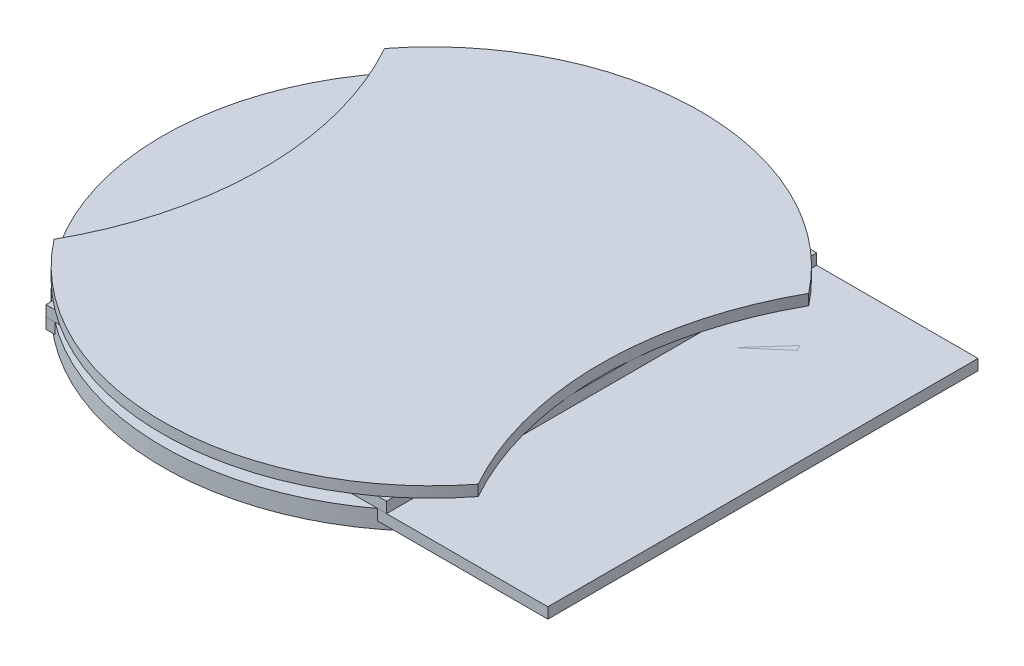
ISO-10303-21;
HEADER;
FILE_DESCRIPTION(('STEP AP214'),'2;1');
FILE_NAME('part.step','',(''),(''),'','','');
FILE_SCHEMA(('AUTOMOTIVE_DESIGN { 1 0 10303 214 1 1 1 1 }'));
ENDSEC;
DATA;
#1=APPLICATION_CONTEXT('core data for automotive mechanical design processes');
#2=APPLICATION_PROTOCOL_DEFINITION('international standard','automotive_design',2000,#1);
#3=PRODUCT_CONTEXT('',#1,'mechanical');
#4=PRODUCT('Part','Part','',(#3));
#5=PRODUCT_RELATED_PRODUCT_CATEGORY('part','',(#4));
#6=PRODUCT_DEFINITION_FORMATION('','',#4);
#7=PRODUCT_DEFINITION_CONTEXT('part definition',#1,'design');
#8=PRODUCT_DEFINITION('design','',#6,#7);
#9=PRODUCT_DEFINITION_SHAPE('','',#8);
#10=(LENGTH_UNIT() NAMED_UNIT(*) SI_UNIT(.MILLI.,.METRE.));
#11=(NAMED_UNIT(*) PLANE_ANGLE_UNIT() SI_UNIT($,.RADIAN.));
#12=(NAMED_UNIT(*) SI_UNIT($,.STERADIAN.) SOLID_ANGLE_UNIT());
#13=UNCERTAINTY_MEASURE_WITH_UNIT(LENGTH_MEASURE(1.E-05),#10,'distance_accuracy_value','');
#14=(GEOMETRIC_REPRESENTATION_CONTEXT(3) GLOBAL_UNCERTAINTY_ASSIGNED_CONTEXT((#13)) GLOBAL_UNIT_ASSIGNED_CONTEXT((#10,
#11,#12)) REPRESENTATION_CONTEXT('',''));
#15=CARTESIAN_POINT('',(0.,0.,0.));
#16=DIRECTION('',(0.,0.,1.));
#17=DIRECTION('',(1.,0.,0.));
#18=AXIS2_PLACEMENT_3D('',#15,#16,#17);
#19=CARTESIAN_POINT('',(7.49999999999986,13.,-5.15));
#20=DIRECTION('',(0.,-1.,0.));
#21=DIRECTION('',(0.,0.,-1.));
#22=AXIS2_PLACEMENT_3D('',#19,#20,#21);
#23=CYLINDRICAL_SURFACE('',#22,1.25);
#24=CARTESIAN_POINT('',(7.49999999999986,3.,-5.15));
#25=DIRECTION('',(0.,-1.,0.));
#26=DIRECTION('',(0.,0.,-1.));
#27=AXIS2_PLACEMENT_3D('',#24,#25,#26);
#28=CIRCLE('',#27,1.25);
#29=CARTESIAN_POINT('',(7.49999999999986,3.,-6.4));
#30=VERTEX_POINT('',#29);
#31=EDGE_CURVE('E87',#30,#30,#28,.F.);
#32=ORIENTED_EDGE('',*,*,#31,.T.);
#33=EDGE_LOOP('',(#32));
#34=FACE_BOUND('',#33,.T.);
#35=CARTESIAN_POINT('',(7.49999999999986,-2.,-5.15));
#36=DIRECTION('',(0.,-1.,0.));
#37=DIRECTION('',(0.,0.,-1.));
#38=AXIS2_PLACEMENT_3D('',#35,#36,#37);
#39=CIRCLE('',#38,1.25);
#40=CARTESIAN_POINT('',(7.49999999999986,-2.,-6.4));
#41=VERTEX_POINT('',#40);
#42=EDGE_CURVE('E96',#41,#41,#39,.T.);
#43=ORIENTED_EDGE('',*,*,#42,.T.);
#44=EDGE_LOOP('',(#43));
#45=FACE_BOUND('',#44,.T.);
#46=ADVANCED_FACE('F49',(#34,#45),#23,.F.);
#47=CARTESIAN_POINT('',(87.4999999999999,13.,-5.14999999999999));
#48=DIRECTION('',(0.,-1.,0.));
#49=DIRECTION('',(0.,0.,-1.));
#50=AXIS2_PLACEMENT_3D('',#47,#48,#49);
#51=CYLINDRICAL_SURFACE('',#50,1.25000000000001);
#52=CARTESIAN_POINT('',(87.4999999999999,3.,-5.14999999999999));
#53=DIRECTION('',(0.,-1.,0.));
#54=DIRECTION('',(0.,0.,-1.));
#55=AXIS2_PLACEMENT_3D('',#52,#53,#54);
#56=CIRCLE('',#55,1.25000000000001);
#57=CARTESIAN_POINT('',(87.4999999999999,3.,-6.4));
#58=VERTEX_POINT('',#57);
#59=EDGE_CURVE('E79',#58,#58,#56,.F.);
#60=ORIENTED_EDGE('',*,*,#59,.T.);
#61=EDGE_LOOP('',(#60));
#62=FACE_BOUND('',#61,.T.);
#63=CARTESIAN_POINT('',(87.4999999999999,-2.,-5.14999999999999));
#64=DIRECTION('',(0.,-1.,0.));
#65=DIRECTION('',(0.,0.,-1.));
#66=AXIS2_PLACEMENT_3D('',#63,#64,#65);
#67=CIRCLE('',#66,1.25000000000001);
#68=CARTESIAN_POINT('',(87.4999999999999,-2.,-6.4));
#69=VERTEX_POINT('',#68);
#70=EDGE_CURVE('E61',#69,#69,#67,.T.);
#71=ORIENTED_EDGE('',*,*,#70,.T.);
#72=EDGE_LOOP('',(#71));
#73=FACE_BOUND('',#72,.T.);
#74=ADVANCED_FACE('F101',(#62,#73),#51,.F.);
#75=CARTESIAN_POINT('',(87.4999999999999,13.,-114.85));
#76=DIRECTION('',(0.,-1.,0.));
#77=DIRECTION('',(0.,0.,-1.));
#78=AXIS2_PLACEMENT_3D('',#75,#76,#77);
#79=CYLINDRICAL_SURFACE('',#78,1.25000000000001);
#80=CARTESIAN_POINT('',(87.4999999999999,3.,-114.85));
#81=DIRECTION('',(0.,-1.,0.));
#82=DIRECTION('',(0.,0.,-1.));
#83=AXIS2_PLACEMENT_3D('',#80,#81,#82);
#84=CIRCLE('',#83,1.25000000000001);
#85=CARTESIAN_POINT('',(87.4999999999999,3.,-116.1));
#86=VERTEX_POINT('',#85);
#87=EDGE_CURVE('E74',#86,#86,#84,.F.);
#88=ORIENTED_EDGE('',*,*,#87,.T.);
#89=EDGE_LOOP('',(#88));
#90=FACE_BOUND('',#89,.T.);
#91=CARTESIAN_POINT('',(87.4999999999999,-2.,-114.85));
#92=DIRECTION('',(0.,-1.,0.));
#93=DIRECTION('',(0.,0.,-1.));
#94=AXIS2_PLACEMENT_3D('',#91,#92,#93);
#95=CIRCLE('',#94,1.25000000000001);
#96=CARTESIAN_POINT('',(87.4999999999999,-2.,-116.1));
#97=VERTEX_POINT('',#96);
#98=EDGE_CURVE('E90',#97,#97,#95,.T.);
#99=ORIENTED_EDGE('',*,*,#98,.T.);
#100=EDGE_LOOP('',(#99));
#101=FACE_BOUND('',#100,.T.);
#102=ADVANCED_FACE('F116',(#90,#101),#79,.F.);
#103=CARTESIAN_POINT('',(7.49999999999986,13.,-114.85));
#104=DIRECTION('',(0.,-1.,0.));
#105=DIRECTION('',(0.,0.,-1.));
#106=AXIS2_PLACEMENT_3D('',#103,#104,#105);
#107=CYLINDRICAL_SURFACE('',#106,1.25);
#108=CARTESIAN_POINT('',(7.49999999999986,3.,-114.85));
#109=DIRECTION('',(0.,-1.,0.));
#110=DIRECTION('',(0.,0.,-1.));
#111=AXIS2_PLACEMENT_3D('',#108,#109,#110);
#112=CIRCLE('',#111,1.25);
#113=CARTESIAN_POINT('',(7.49999999999986,3.,-116.1));
#114=VERTEX_POINT('',#113);
#115=EDGE_CURVE('E70',#114,#114,#112,.F.);
#116=ORIENTED_EDGE('',*,*,#115,.T.);
#117=EDGE_LOOP('',(#116));
#118=FACE_BOUND('',#117,.T.);
#119=CARTESIAN_POINT('',(7.49999999999986,-2.,-114.85));
#120=DIRECTION('',(0.,-1.,0.));
#121=DIRECTION('',(0.,0.,-1.));
#122=AXIS2_PLACEMENT_3D('',#119,#120,#121);
#123=CIRCLE('',#122,1.25);
#124=CARTESIAN_POINT('',(7.49999999999986,-2.,-116.1));
#125=VERTEX_POINT('',#124);
#126=EDGE_CURVE('E93',#125,#125,#123,.T.);
#127=ORIENTED_EDGE('',*,*,#126,.T.);
#128=EDGE_LOOP('',(#127));
#129=FACE_BOUND('',#128,.T.);
#130=ADVANCED_FACE('F118',(#118,#129),#107,.F.);
#131=CARTESIAN_POINT('',(47.5,3.,-60.));
#132=DIRECTION('',(0.,-1.,0.));
#133=DIRECTION('',(0.,0.,-1.));
#134=AXIS2_PLACEMENT_3D('',#131,#132,#133);
#135=PLANE('',#134);
#136=CARTESIAN_POINT('',(111.7,3.,-60.));
#137=DIRECTION('',(0.,1.,0.));
#138=DIRECTION('',(0.,0.,1.));
#139=AXIS2_PLACEMENT_3D('',#136,#137,#138);
#140=CIRCLE('',#139,8.50000000000001);
#141=CARTESIAN_POINT('',(111.7,3.,-51.5));
#142=VERTEX_POINT('',#141);
#143=EDGE_CURVE('E166',#142,#142,#140,.T.);
#144=ORIENTED_EDGE('',*,*,#143,.F.);
#145=EDGE_LOOP('',(#144));
#146=FACE_BOUND('',#145,.T.);
#147=CARTESIAN_POINT('',(79.7,3.,-60.));
#148=DIRECTION('',(0.,1.,0.));
#149=DIRECTION('',(0.,0.,1.));
#150=AXIS2_PLACEMENT_3D('',#147,#148,#149);
#151=CIRCLE('',#150,8.50000000000001);
#152=CARTESIAN_POINT('',(79.7,3.,-51.5));
#153=VERTEX_POINT('',#152);
#154=EDGE_CURVE('E68',#153,#153,#151,.T.);
#155=ORIENTED_EDGE('',*,*,#154,.F.);
#156=EDGE_LOOP('',(#155));
#157=FACE_BOUND('',#156,.T.);
#158=CARTESIAN_POINT('',(47.5,3.,-60.));
#159=DIRECTION('',(0.,1.,0.));
#160=DIRECTION('',(0.,0.,1.));
#161=AXIS2_PLACEMENT_3D('',#158,#159,#160);
#162=CIRCLE('',#161,8.5);
#163=CARTESIAN_POINT('',(47.5,3.,-51.5));
#164=VERTEX_POINT('',#163);
#165=EDGE_CURVE('E82',#164,#164,#162,.T.);
#166=ORIENTED_EDGE('',*,*,#165,.F.);
#167=EDGE_LOOP('',(#166));
#168=FACE_BOUND('',#167,.T.);
#169=CARTESIAN_POINT('',(47.5,3.,-60.));
#170=DIRECTION('',(0.,-1.,0.));
#171=DIRECTION('',(0.,0.,-1.));
#172=AXIS2_PLACEMENT_3D('',#169,#170,#171);
#173=CIRCLE('',#172,75.);
#174=CARTESIAN_POINT('',(47.5,3.,-135.));
#175=VERTEX_POINT('',#174);
#176=EDGE_CURVE('E11',#175,#175,#173,.T.);
#177=ORIENTED_EDGE('',*,*,#176,.F.);
#178=EDGE_LOOP('',(#177));
#179=FACE_BOUND('',#178,.T.);
#180=ORIENTED_EDGE('',*,*,#59,.F.);
#181=EDGE_LOOP('',(#180));
#182=FACE_BOUND('',#181,.T.);
#183=ORIENTED_EDGE('',*,*,#115,.F.);
#184=EDGE_LOOP('',(#183));
#185=FACE_BOUND('',#184,.T.);
#186=ORIENTED_EDGE('',*,*,#87,.F.);
#187=EDGE_LOOP('',(#186));
#188=FACE_BOUND('',#187,.T.);
#189=ORIENTED_EDGE('',*,*,#31,.F.);
#190=EDGE_LOOP('',(#189));
#191=FACE_BOUND('',#190,.T.);
#192=ADVANCED_FACE('F107',(#146,#157,#168,#179,#182,#185,#188,#191),#135,.F.);
#193=CARTESIAN_POINT('',(47.5,-2.,-60.));
#194=DIRECTION('',(0.,-1.,0.));
#195=DIRECTION('',(0.,0.,-1.));
#196=AXIS2_PLACEMENT_3D('',#193,#194,#195);
#197=PLANE('',#196);
#198=CARTESIAN_POINT('',(111.7,-2.,-60.));
#199=DIRECTION('',(0.,-1.,0.));
#200=DIRECTION('',(0.,0.,-1.));
#201=AXIS2_PLACEMENT_3D('',#198,#199,#200);
#202=CIRCLE('',#201,8.50000000000001);
#203=CARTESIAN_POINT('',(111.7,-2.,-68.5));
#204=VERTEX_POINT('',#203);
#205=EDGE_CURVE('E52',#204,#204,#202,.T.);
#206=ORIENTED_EDGE('',*,*,#205,.F.);
#207=EDGE_LOOP('',(#206));
#208=FACE_BOUND('',#207,.T.);
#209=CARTESIAN_POINT('',(79.7,-2.,-60.));
#210=DIRECTION('',(0.,-1.,0.));
#211=DIRECTION('',(0.,0.,-1.));
#212=AXIS2_PLACEMENT_3D('',#209,#210,#211);
#213=CIRCLE('',#212,8.50000000000001);
#214=CARTESIAN_POINT('',(79.7,-2.,-68.5));
#215=VERTEX_POINT('',#214);
#216=EDGE_CURVE('E67',#215,#215,#213,.T.);
#217=ORIENTED_EDGE('',*,*,#216,.F.);
#218=EDGE_LOOP('',(#217));
#219=FACE_BOUND('',#218,.T.);
#220=CARTESIAN_POINT('',(47.5,-2.,-60.));
#221=DIRECTION('',(0.,-1.,0.));
#222=DIRECTION('',(0.,0.,-1.));
#223=AXIS2_PLACEMENT_3D('',#220,#221,#222);
#224=CIRCLE('',#223,8.5);
#225=CARTESIAN_POINT('',(47.5,-2.,-68.5));
#226=VERTEX_POINT('',#225);
#227=EDGE_CURVE('E65',#226,#226,#224,.T.);
#228=ORIENTED_EDGE('',*,*,#227,.F.);
#229=EDGE_LOOP('',(#228));
#230=FACE_BOUND('',#229,.T.);
#231=ORIENTED_EDGE('',*,*,#126,.F.);
#232=EDGE_LOOP('',(#231));
#233=FACE_BOUND('',#232,.T.);
#234=ORIENTED_EDGE('',*,*,#70,.F.);
#235=EDGE_LOOP('',(#234));
#236=FACE_BOUND('',#235,.T.);
#237=CARTESIAN_POINT('',(47.5,-2.,-60.));
#238=DIRECTION('',(0.,-1.,0.));
#239=DIRECTION('',(0.,0.,-1.));
#240=AXIS2_PLACEMENT_3D('',#237,#238,#239);
#241=CIRCLE('',#240,75.);
#242=CARTESIAN_POINT('',(47.5,-2.,-135.));
#243=VERTEX_POINT('',#242);
#244=EDGE_CURVE('E56',#243,#243,#241,.T.);
#245=ORIENTED_EDGE('',*,*,#244,.T.);
#246=EDGE_LOOP('',(#245));
#247=FACE_BOUND('',#246,.T.);
#248=ORIENTED_EDGE('',*,*,#42,.F.);
#249=EDGE_LOOP('',(#248));
#250=FACE_BOUND('',#249,.T.);
#251=ORIENTED_EDGE('',*,*,#98,.F.);
#252=EDGE_LOOP('',(#251));
#253=FACE_BOUND('',#252,.T.);
#254=ADVANCED_FACE('F103',(#208,#219,#230,#233,#236,#247,#250,#253),#197,.T.);
#255=CARTESIAN_POINT('',(47.5,-2.,-60.));
#256=DIRECTION('',(0.,1.,0.));
#257=DIRECTION('',(0.,0.,1.));
#258=AXIS2_PLACEMENT_3D('',#255,#256,#257);
#259=CYLINDRICAL_SURFACE('',#258,75.);
#260=ORIENTED_EDGE('',*,*,#244,.F.);
#261=EDGE_LOOP('',(#260));
#262=FACE_BOUND('',#261,.T.);
#263=ORIENTED_EDGE('',*,*,#176,.T.);
#264=EDGE_LOOP('',(#263));
#265=FACE_BOUND('',#264,.T.);
#266=ADVANCED_FACE('F106',(#262,#265),#259,.T.);
#267=CARTESIAN_POINT('',(47.5,-7.,-60.));
#268=DIRECTION('',(0.,1.,0.));
#269=DIRECTION('',(0.,0.,1.));
#270=AXIS2_PLACEMENT_3D('',#267,#268,#269);
#271=CYLINDRICAL_SURFACE('',#270,8.5);
#272=ORIENTED_EDGE('',*,*,#227,.T.);
#273=EDGE_LOOP('',(#272));
#274=FACE_BOUND('',#273,.T.);
#275=ORIENTED_EDGE('',*,*,#165,.T.);
#276=EDGE_LOOP('',(#275));
#277=FACE_BOUND('',#276,.T.);
#278=ADVANCED_FACE('F144',(#274,#277),#271,.F.);
#279=CARTESIAN_POINT('',(79.7,-7.,-60.));
#280=DIRECTION('',(0.,1.,0.));
#281=DIRECTION('',(0.,0.,1.));
#282=AXIS2_PLACEMENT_3D('',#279,#280,#281);
#283=CYLINDRICAL_SURFACE('',#282,8.50000000000001);
#284=ORIENTED_EDGE('',*,*,#216,.T.);
#285=EDGE_LOOP('',(#284));
#286=FACE_BOUND('',#285,.T.);
#287=ORIENTED_EDGE('',*,*,#154,.T.);
#288=EDGE_LOOP('',(#287));
#289=FACE_BOUND('',#288,.T.);
#290=ADVANCED_FACE('F149',(#286,#289),#283,.F.);
#291=CARTESIAN_POINT('',(111.7,-7.,-60.));
#292=DIRECTION('',(0.,1.,0.));
#293=DIRECTION('',(0.,0.,1.));
#294=AXIS2_PLACEMENT_3D('',#291,#292,#293);
#295=CYLINDRICAL_SURFACE('',#294,8.50000000000001);
#296=ORIENTED_EDGE('',*,*,#205,.T.);
#297=EDGE_LOOP('',(#296));
#298=FACE_BOUND('',#297,.T.);
#299=ORIENTED_EDGE('',*,*,#143,.T.);
#300=EDGE_LOOP('',(#299));
#301=FACE_BOUND('',#300,.T.);
#302=ADVANCED_FACE('F154',(#298,#301),#295,.F.);
#303=CLOSED_SHELL('',(#46,#74,#102,#130,#192,#254,#266,#278,#290,#302));
#304=MANIFOLD_SOLID_BREP('B2',#303);
#305=CARTESIAN_POINT('',(47.5,9.,-60.));
#306=DIRECTION('',(0.,-1.,0.));
#307=DIRECTION('',(0.,0.,-1.));
#308=AXIS2_PLACEMENT_3D('',#305,#306,#307);
#309=CYLINDRICAL_SURFACE('',#308,75.);
#310=CARTESIAN_POINT('',(47.5,6.,-60.));
#311=DIRECTION('',(0.,1.,0.));
#312=DIRECTION('',(0.,0.,1.));
#313=AXIS2_PLACEMENT_3D('',#310,#311,#312);
#314=CIRCLE('',#313,75.);
#315=CARTESIAN_POINT('',(106.66,6.,-106.098746186854));
#316=VERTEX_POINT('',#315);
#317=CARTESIAN_POINT('',(-11.66,6.,-106.098746186854));
#318=VERTEX_POINT('',#317);
#319=EDGE_CURVE('E320',#316,#318,#314,.T.);
#320=ORIENTED_EDGE('',*,*,#319,.T.);
#321=DIRECTION('',(0.,1.,0.));
#322=VECTOR('',#321,1.);
#323=CARTESIAN_POINT('',(-11.66,0.,-106.098746186854));
#324=LINE('',#323,#322);
#325=CARTESIAN_POINT('',(-11.66,9.,-106.098746186854));
#326=VERTEX_POINT('',#325);
#327=EDGE_CURVE('E279',#318,#326,#324,.T.);
#328=ORIENTED_EDGE('',*,*,#327,.T.);
#329=CARTESIAN_POINT('',(47.5,9.,-60.));
#330=DIRECTION('',(0.,1.,0.));
#331=DIRECTION('',(0.,0.,1.));
#332=AXIS2_PLACEMENT_3D('',#329,#330,#331);
#333=CIRCLE('',#332,75.);
#334=CARTESIAN_POINT('',(106.66,9.,-106.098746186854));
#335=VERTEX_POINT('',#334);
#336=EDGE_CURVE('E318',#335,#326,#333,.T.);
#337=ORIENTED_EDGE('',*,*,#336,.F.);
#338=DIRECTION('',(0.,1.,0.));
#339=VECTOR('',#338,1.);
#340=CARTESIAN_POINT('',(106.66,0.,-106.098746186854));
#341=LINE('',#340,#339);
#342=EDGE_CURVE('E326',#316,#335,#341,.T.);
#343=ORIENTED_EDGE('',*,*,#342,.F.);
#344=EDGE_LOOP('',(#320,#328,#337,#343));
#345=FACE_BOUND('',#344,.T.);
#346=ADVANCED_FACE('F264',(#345),#309,.T.);
#347=CARTESIAN_POINT('',(-11.66,9.,-13.9012538131458));
#348=VERTEX_POINT('',#347);
#349=CARTESIAN_POINT('',(106.66,9.,-13.9012538131458));
#350=VERTEX_POINT('',#349);
#351=EDGE_CURVE('E316',#348,#350,#333,.T.);
#352=ORIENTED_EDGE('',*,*,#351,.F.);
#353=DIRECTION('',(0.,1.,0.));
#354=VECTOR('',#353,1.);
#355=CARTESIAN_POINT('',(-11.66,0.,-13.9012538131458));
#356=LINE('',#355,#354);
#357=CARTESIAN_POINT('',(-11.66,6.,-13.9012538131458));
#358=VERTEX_POINT('',#357);
#359=EDGE_CURVE('E302',#358,#348,#356,.T.);
#360=ORIENTED_EDGE('',*,*,#359,.F.);
#361=CARTESIAN_POINT('',(106.66,6.,-13.9012538131458));
#362=VERTEX_POINT('',#361);
#363=EDGE_CURVE('E323',#358,#362,#314,.T.);
#364=ORIENTED_EDGE('',*,*,#363,.T.);
#365=DIRECTION('',(0.,1.,0.));
#366=VECTOR('',#365,1.);
#367=CARTESIAN_POINT('',(106.66,0.,-13.9012538131458));
#368=LINE('',#367,#366);
#369=EDGE_CURVE('E286',#362,#350,#368,.T.);
#370=ORIENTED_EDGE('',*,*,#369,.T.);
#371=EDGE_LOOP('',(#352,#360,#364,#370));
#372=FACE_BOUND('',#371,.T.);
#373=ADVANCED_FACE('F266',(#372),#309,.T.);
#374=CARTESIAN_POINT('',(47.5,9.,-60.));
#375=DIRECTION('',(0.,1.,0.));
#376=DIRECTION('',(0.,0.,1.));
#377=AXIS2_PLACEMENT_3D('',#374,#375,#376);
#378=PLANE('',#377);
#379=CARTESIAN_POINT('',(-94.126810840622,9.,-60.));
#380=DIRECTION('',(0.,1.,0.));
#381=DIRECTION('',(0.,0.,-1.));
#382=AXIS2_PLACEMENT_3D('',#379,#380,#381);
#383=CIRCLE('',#382,94.4768187981736);
#384=EDGE_CURVE('E305',#348,#326,#383,.T.);
#385=ORIENTED_EDGE('',*,*,#384,.F.);
#386=ORIENTED_EDGE('',*,*,#351,.T.);
#387=CARTESIAN_POINT('',(189.126810840622,9.,-60.));
#388=DIRECTION('',(0.,1.,0.));
#389=DIRECTION('',(0.,0.,1.));
#390=AXIS2_PLACEMENT_3D('',#387,#388,#389);
#391=CIRCLE('',#390,94.4768187981736);
#392=EDGE_CURVE('E334',#335,#350,#391,.T.);
#393=ORIENTED_EDGE('',*,*,#392,.F.);
#394=ORIENTED_EDGE('',*,*,#336,.T.);
#395=EDGE_LOOP('',(#385,#386,#393,#394));
#396=FACE_BOUND('',#395,.T.);
#397=ADVANCED_FACE('F314',(#396),#378,.T.);
#398=CARTESIAN_POINT('',(47.5,6.,-60.));
#399=DIRECTION('',(0.,1.,0.));
#400=DIRECTION('',(0.,0.,1.));
#401=AXIS2_PLACEMENT_3D('',#398,#399,#400);
#402=PLANE('',#401);
#403=ORIENTED_EDGE('',*,*,#363,.F.);
#404=CARTESIAN_POINT('',(-94.126810840622,6.,-60.));
#405=DIRECTION('',(0.,1.,0.));
#406=DIRECTION('',(0.,0.,1.));
#407=AXIS2_PLACEMENT_3D('',#404,#405,#406);
#408=CIRCLE('',#407,94.4768187981736);
#409=EDGE_CURVE('E47',#358,#318,#408,.T.);
#410=ORIENTED_EDGE('',*,*,#409,.T.);
#411=ORIENTED_EDGE('',*,*,#319,.F.);
#412=CARTESIAN_POINT('',(189.126810840622,6.,-60.));
#413=DIRECTION('',(0.,1.,0.));
#414=DIRECTION('',(0.,0.,1.));
#415=AXIS2_PLACEMENT_3D('',#412,#413,#414);
#416=CIRCLE('',#415,94.4768187981736);
#417=EDGE_CURVE('E272',#316,#362,#416,.T.);
#418=ORIENTED_EDGE('',*,*,#417,.T.);
#419=EDGE_LOOP('',(#403,#410,#411,#418));
#420=FACE_BOUND('',#419,.T.);
#421=ADVANCED_FACE('F330',(#420),#402,.F.);
#422=CARTESIAN_POINT('',(189.126810840622,0.,-60.));
#423=DIRECTION('',(0.,1.,0.));
#424=DIRECTION('',(0.,0.,1.));
#425=AXIS2_PLACEMENT_3D('',#422,#423,#424);
#426=CYLINDRICAL_SURFACE('',#425,94.4768187981736);
#427=ORIENTED_EDGE('',*,*,#342,.T.);
#428=ORIENTED_EDGE('',*,*,#392,.T.);
#429=ORIENTED_EDGE('',*,*,#369,.F.);
#430=ORIENTED_EDGE('',*,*,#417,.F.);
#431=EDGE_LOOP('',(#427,#428,#429,#430));
#432=FACE_BOUND('',#431,.T.);
#433=ADVANCED_FACE('F332',(#432),#426,.F.);
#434=CARTESIAN_POINT('',(-94.126810840622,0.,-60.));
#435=DIRECTION('',(0.,1.,0.));
#436=DIRECTION('',(0.,0.,1.));
#437=AXIS2_PLACEMENT_3D('',#434,#435,#436);
#438=CYLINDRICAL_SURFACE('',#437,94.4768187981736);
#439=ORIENTED_EDGE('',*,*,#359,.T.);
#440=ORIENTED_EDGE('',*,*,#384,.T.);
#441=ORIENTED_EDGE('',*,*,#327,.F.);
#442=ORIENTED_EDGE('',*,*,#409,.F.);
#443=EDGE_LOOP('',(#439,#440,#441,#442));
#444=FACE_BOUND('',#443,.T.);
#445=ADVANCED_FACE('F304',(#444),#438,.F.);
#446=CLOSED_SHELL('',(#346,#373,#397,#421,#433,#445));
#447=MANIFOLD_SOLID_BREP('B6_NOT_SHOWN',#446);
#448=CARTESIAN_POINT('',(0.,6.,-120.));
#449=DIRECTION('',(1.,0.,0.));
#450=DIRECTION('',(0.,0.,-1.));
#451=AXIS2_PLACEMENT_3D('',#448,#449,#450);
#452=PLANE('',#451);
#453=DIRECTION('',(0.,0.,1.));
#454=VECTOR('',#453,1.);
#455=CARTESIAN_POINT('',(0.,3.,-120.));
#456=LINE('',#455,#454);
#457=CARTESIAN_POINT('',(0.,3.,-120.));
#458=VERTEX_POINT('',#457);
#459=CARTESIAN_POINT('',(0.,3.,0.));
#460=VERTEX_POINT('',#459);
#461=EDGE_CURVE('E456',#458,#460,#456,.T.);
#462=ORIENTED_EDGE('',*,*,#461,.T.);
#463=DIRECTION('',(0.,-1.,0.));
#464=VECTOR('',#463,1.);
#465=CARTESIAN_POINT('',(0.,6.,0.));
#466=LINE('',#465,#464);
#467=CARTESIAN_POINT('',(0.,6.,0.));
#468=VERTEX_POINT('',#467);
#469=EDGE_CURVE('E262',#468,#460,#466,.T.);
#470=ORIENTED_EDGE('',*,*,#469,.F.);
#471=DIRECTION('',(0.,0.,1.));
#472=VECTOR('',#471,1.);
#473=CARTESIAN_POINT('',(0.,6.,-120.));
#474=LINE('',#473,#472);
#475=CARTESIAN_POINT('',(0.,6.,-120.));
#476=VERTEX_POINT('',#475);
#477=EDGE_CURVE('E444',#476,#468,#474,.T.);
#478=ORIENTED_EDGE('',*,*,#477,.F.);
#479=DIRECTION('',(0.,-1.,0.));
#480=VECTOR('',#479,1.);
#481=CARTESIAN_POINT('',(0.,6.,-120.));
#482=LINE('',#481,#480);
#483=EDGE_CURVE('E452',#476,#458,#482,.T.);
#484=ORIENTED_EDGE('',*,*,#483,.T.);
#485=EDGE_LOOP('',(#462,#470,#478,#484));
#486=FACE_BOUND('',#485,.T.);
#487=ADVANCED_FACE('F393',(#486),#452,.F.);
#488=CARTESIAN_POINT('',(0.,6.,0.));
#489=DIRECTION('',(0.,0.,-1.));
#490=DIRECTION('',(-1.,0.,0.));
#491=AXIS2_PLACEMENT_3D('',#488,#489,#490);
#492=PLANE('',#491);
#493=DIRECTION('',(1.,0.,0.));
#494=VECTOR('',#493,1.);
#495=CARTESIAN_POINT('',(0.,3.,0.));
#496=LINE('',#495,#494);
#497=CARTESIAN_POINT('',(95.,3.,0.));
#498=VERTEX_POINT('',#497);
#499=EDGE_CURVE('E448',#460,#498,#496,.T.);
#500=ORIENTED_EDGE('',*,*,#499,.T.);
#501=DIRECTION('',(0.,-1.,0.));
#502=VECTOR('',#501,1.);
#503=CARTESIAN_POINT('',(95.,6.,0.));
#504=LINE('',#503,#502);
#505=CARTESIAN_POINT('',(95.,6.,0.));
#506=VERTEX_POINT('',#505);
#507=EDGE_CURVE('E401',#506,#498,#504,.T.);
#508=ORIENTED_EDGE('',*,*,#507,.F.);
#509=DIRECTION('',(1.,0.,0.));
#510=VECTOR('',#509,1.);
#511=CARTESIAN_POINT('',(0.,6.,0.));
#512=LINE('',#511,#510);
#513=EDGE_CURVE('E439',#468,#506,#512,.T.);
#514=ORIENTED_EDGE('',*,*,#513,.F.);
#515=ORIENTED_EDGE('',*,*,#469,.T.);
#516=EDGE_LOOP('',(#500,#508,#514,#515));
#517=FACE_BOUND('',#516,.T.);
#518=ADVANCED_FACE('F447',(#517),#492,.F.);
#519=CARTESIAN_POINT('',(95.,6.,-120.));
#520=DIRECTION('',(-1.,0.,0.));
#521=DIRECTION('',(0.,0.,1.));
#522=AXIS2_PLACEMENT_3D('',#519,#520,#521);
#523=PLANE('',#522);
#524=DIRECTION('',(0.,0.,-1.));
#525=VECTOR('',#524,1.);
#526=CARTESIAN_POINT('',(95.,3.,-120.));
#527=LINE('',#526,#525);
#528=CARTESIAN_POINT('',(95.,3.,-120.));
#529=VERTEX_POINT('',#528);
#530=EDGE_CURVE('E426',#498,#529,#527,.T.);
#531=ORIENTED_EDGE('',*,*,#530,.T.);
#532=DIRECTION('',(0.,-1.,0.));
#533=VECTOR('',#532,1.);
#534=CARTESIAN_POINT('',(95.,6.,-120.));
#535=LINE('',#534,#533);
#536=CARTESIAN_POINT('',(95.,6.,-120.));
#537=VERTEX_POINT('',#536);
#538=EDGE_CURVE('E449',#537,#529,#535,.T.);
#539=ORIENTED_EDGE('',*,*,#538,.F.);
#540=DIRECTION('',(0.,0.,-1.));
#541=VECTOR('',#540,1.);
#542=CARTESIAN_POINT('',(95.,6.,-120.));
#543=LINE('',#542,#541);
#544=EDGE_CURVE('E442',#506,#537,#543,.T.);
#545=ORIENTED_EDGE('',*,*,#544,.F.);
#546=ORIENTED_EDGE('',*,*,#507,.T.);
#547=EDGE_LOOP('',(#531,#539,#545,#546));
#548=FACE_BOUND('',#547,.T.);
#549=ADVANCED_FACE('F450',(#548),#523,.F.);
#550=CARTESIAN_POINT('',(0.,6.,-120.));
#551=DIRECTION('',(0.,0.,1.));
#552=DIRECTION('',(1.,0.,0.));
#553=AXIS2_PLACEMENT_3D('',#550,#551,#552);
#554=PLANE('',#553);
#555=DIRECTION('',(-1.,0.,0.));
#556=VECTOR('',#555,1.);
#557=CARTESIAN_POINT('',(0.,3.,-120.));
#558=LINE('',#557,#556);
#559=EDGE_CURVE('E432',#529,#458,#558,.T.);
#560=ORIENTED_EDGE('',*,*,#559,.T.);
#561=ORIENTED_EDGE('',*,*,#483,.F.);
#562=DIRECTION('',(-1.,0.,0.));
#563=VECTOR('',#562,1.);
#564=CARTESIAN_POINT('',(0.,6.,-120.));
#565=LINE('',#564,#563);
#566=EDGE_CURVE('E409',#537,#476,#565,.T.);
#567=ORIENTED_EDGE('',*,*,#566,.F.);
#568=ORIENTED_EDGE('',*,*,#538,.T.);
#569=EDGE_LOOP('',(#560,#561,#567,#568));
#570=FACE_BOUND('',#569,.T.);
#571=ADVANCED_FACE('F463',(#570),#554,.F.);
#572=CARTESIAN_POINT('',(0.,6.,0.));
#573=DIRECTION('',(0.,1.,0.));
#574=DIRECTION('',(0.,0.,1.));
#575=AXIS2_PLACEMENT_3D('',#572,#573,#574);
#576=PLANE('',#575);
#577=ORIENTED_EDGE('',*,*,#477,.T.);
#578=ORIENTED_EDGE('',*,*,#513,.T.);
#579=ORIENTED_EDGE('',*,*,#544,.T.);
#580=ORIENTED_EDGE('',*,*,#566,.T.);
#581=EDGE_LOOP('',(#577,#578,#579,#580));
#582=FACE_BOUND('',#581,.T.);
#583=ADVANCED_FACE('F440',(#582),#576,.T.);
#584=CARTESIAN_POINT('',(0.,3.,0.));
#585=DIRECTION('',(0.,1.,0.));
#586=DIRECTION('',(0.,0.,1.));
#587=AXIS2_PLACEMENT_3D('',#584,#585,#586);
#588=PLANE('',#587);
#589=ORIENTED_EDGE('',*,*,#461,.F.);
#590=ORIENTED_EDGE('',*,*,#559,.F.);
#591=ORIENTED_EDGE('',*,*,#530,.F.);
#592=ORIENTED_EDGE('',*,*,#499,.F.);
#593=EDGE_LOOP('',(#589,#590,#591,#592));
#594=FACE_BOUND('',#593,.T.);
#595=ADVANCED_FACE('F466',(#594),#588,.F.);
#596=CLOSED_SHELL('',(#487,#518,#549,#571,#583,#595));
#597=MANIFOLD_SOLID_BREP('B41_NOT_SHOWN',#596);
#598=CARTESIAN_POINT('',(0.,3.,0.));
#599=DIRECTION('',(1.,0.,0.));
#600=DIRECTION('',(0.,0.,-1.));
#601=AXIS2_PLACEMENT_3D('',#598,#599,#600);
#602=PLANE('',#601);
#603=DIRECTION('',(0.,0.,1.));
#604=VECTOR('',#603,1.);
#605=CARTESIAN_POINT('',(0.,0.,0.));
#606=LINE('',#605,#604);
#607=CARTESIAN_POINT('',(0.,0.,-120.));
#608=VERTEX_POINT('',#607);
#609=CARTESIAN_POINT('',(0.,0.,0.));
#610=VERTEX_POINT('',#609);
#611=EDGE_CURVE('E579',#608,#610,#606,.T.);
#612=ORIENTED_EDGE('',*,*,#611,.T.);
#613=DIRECTION('',(0.,-1.,0.));
#614=VECTOR('',#613,1.);
#615=CARTESIAN_POINT('',(0.,3.,0.));
#616=LINE('',#615,#614);
#617=CARTESIAN_POINT('',(0.,3.,0.));
#618=VERTEX_POINT('',#617);
#619=EDGE_CURVE('E391',#618,#610,#616,.T.);
#620=ORIENTED_EDGE('',*,*,#619,.F.);
#621=DIRECTION('',(0.,0.,1.));
#622=VECTOR('',#621,1.);
#623=CARTESIAN_POINT('',(0.,3.,0.));
#624=LINE('',#623,#622);
#625=CARTESIAN_POINT('',(0.,3.,-120.));
#626=VERTEX_POINT('',#625);
#627=EDGE_CURVE('E567',#626,#618,#624,.T.);
#628=ORIENTED_EDGE('',*,*,#627,.F.);
#629=DIRECTION('',(0.,-1.,0.));
#630=VECTOR('',#629,1.);
#631=CARTESIAN_POINT('',(0.,3.,-120.));
#632=LINE('',#631,#630);
#633=EDGE_CURVE('E575',#626,#608,#632,.T.);
#634=ORIENTED_EDGE('',*,*,#633,.T.);
#635=EDGE_LOOP('',(#612,#620,#628,#634));
#636=FACE_BOUND('',#635,.T.);
#637=ADVANCED_FACE('F516',(#636),#602,.F.);
#638=CARTESIAN_POINT('',(0.,3.,0.));
#639=DIRECTION('',(0.,0.,-1.));
#640=DIRECTION('',(-1.,0.,0.));
#641=AXIS2_PLACEMENT_3D('',#638,#639,#640);
#642=PLANE('',#641);
#643=DIRECTION('',(1.,0.,0.));
#644=VECTOR('',#643,1.);
#645=CARTESIAN_POINT('',(0.,0.,0.));
#646=LINE('',#645,#644);
#647=CARTESIAN_POINT('',(140.,0.,0.));
#648=VERTEX_POINT('',#647);
#649=EDGE_CURVE('E571',#610,#648,#646,.T.);
#650=ORIENTED_EDGE('',*,*,#649,.T.);
#651=DIRECTION('',(0.,-1.,0.));
#652=VECTOR('',#651,1.);
#653=CARTESIAN_POINT('',(140.,3.,0.));
#654=LINE('',#653,#652);
#655=CARTESIAN_POINT('',(140.,3.,0.));
#656=VERTEX_POINT('',#655);
#657=EDGE_CURVE('E524',#656,#648,#654,.T.);
#658=ORIENTED_EDGE('',*,*,#657,.F.);
#659=DIRECTION('',(1.,0.,0.));
#660=VECTOR('',#659,1.);
#661=CARTESIAN_POINT('',(0.,3.,0.));
#662=LINE('',#661,#660);
#663=EDGE_CURVE('E562',#618,#656,#662,.T.);
#664=ORIENTED_EDGE('',*,*,#663,.F.);
#665=ORIENTED_EDGE('',*,*,#619,.T.);
#666=EDGE_LOOP('',(#650,#658,#664,#665));
#667=FACE_BOUND('',#666,.T.);
#668=ADVANCED_FACE('F570',(#667),#642,.F.);
#669=CARTESIAN_POINT('',(140.,3.,0.));
#670=DIRECTION('',(-1.,0.,0.));
#671=DIRECTION('',(0.,0.,1.));
#672=AXIS2_PLACEMENT_3D('',#669,#670,#671);
#673=PLANE('',#672);
#674=DIRECTION('',(0.,0.,-1.));
#675=VECTOR('',#674,1.);
#676=CARTESIAN_POINT('',(140.,0.,0.));
#677=LINE('',#676,#675);
#678=CARTESIAN_POINT('',(140.,0.,-120.));
#679=VERTEX_POINT('',#678);
#680=EDGE_CURVE('E549',#648,#679,#677,.T.);
#681=ORIENTED_EDGE('',*,*,#680,.T.);
#682=DIRECTION('',(0.,-1.,0.));
#683=VECTOR('',#682,1.);
#684=CARTESIAN_POINT('',(140.,3.,-120.));
#685=LINE('',#684,#683);
#686=CARTESIAN_POINT('',(140.,3.,-120.));
#687=VERTEX_POINT('',#686);
#688=EDGE_CURVE('E572',#687,#679,#685,.T.);
#689=ORIENTED_EDGE('',*,*,#688,.F.);
#690=DIRECTION('',(0.,0.,-1.));
#691=VECTOR('',#690,1.);
#692=CARTESIAN_POINT('',(140.,3.,0.));
#693=LINE('',#692,#691);
#694=EDGE_CURVE('E565',#656,#687,#693,.T.);
#695=ORIENTED_EDGE('',*,*,#694,.F.);
#696=ORIENTED_EDGE('',*,*,#657,.T.);
#697=EDGE_LOOP('',(#681,#689,#695,#696));
#698=FACE_BOUND('',#697,.T.);
#699=ADVANCED_FACE('F573',(#698),#673,.F.);
#700=CARTESIAN_POINT('',(0.,3.,-120.));
#701=DIRECTION('',(0.,0.,1.));
#702=DIRECTION('',(1.,0.,0.));
#703=AXIS2_PLACEMENT_3D('',#700,#701,#702);
#704=PLANE('',#703);
#705=DIRECTION('',(-1.,0.,0.));
#706=VECTOR('',#705,1.);
#707=CARTESIAN_POINT('',(0.,0.,-120.));
#708=LINE('',#707,#706);
#709=EDGE_CURVE('E555',#679,#608,#708,.T.);
#710=ORIENTED_EDGE('',*,*,#709,.T.);
#711=ORIENTED_EDGE('',*,*,#633,.F.);
#712=DIRECTION('',(-1.,0.,0.));
#713=VECTOR('',#712,1.);
#714=CARTESIAN_POINT('',(0.,3.,-120.));
#715=LINE('',#714,#713);
#716=EDGE_CURVE('E532',#687,#626,#715,.T.);
#717=ORIENTED_EDGE('',*,*,#716,.F.);
#718=ORIENTED_EDGE('',*,*,#688,.T.);
#719=EDGE_LOOP('',(#710,#711,#717,#718));
#720=FACE_BOUND('',#719,.T.);
#721=ADVANCED_FACE('F586',(#720),#704,.F.);
#722=CARTESIAN_POINT('',(0.,3.,0.));
#723=DIRECTION('',(0.,-1.,0.));
#724=DIRECTION('',(0.,0.,-1.));
#725=AXIS2_PLACEMENT_3D('',#722,#723,#724);
#726=PLANE('',#725);
#727=ORIENTED_EDGE('',*,*,#627,.T.);
#728=ORIENTED_EDGE('',*,*,#663,.T.);
#729=ORIENTED_EDGE('',*,*,#694,.T.);
#730=ORIENTED_EDGE('',*,*,#716,.T.);
#731=EDGE_LOOP('',(#727,#728,#729,#730));
#732=FACE_BOUND('',#731,.T.);
#733=ADVANCED_FACE('F563',(#732),#726,.F.);
#734=CARTESIAN_POINT('',(0.,0.,0.));
#735=DIRECTION('',(0.,-1.,0.));
#736=DIRECTION('',(0.,0.,-1.));
#737=AXIS2_PLACEMENT_3D('',#734,#735,#736);
#738=PLANE('',#737);
#739=ORIENTED_EDGE('',*,*,#611,.F.);
#740=ORIENTED_EDGE('',*,*,#709,.F.);
#741=ORIENTED_EDGE('',*,*,#680,.F.);
#742=ORIENTED_EDGE('',*,*,#649,.F.);
#743=EDGE_LOOP('',(#739,#740,#741,#742));
#744=FACE_BOUND('',#743,.T.);
#745=ADVANCED_FACE('F589',(#744),#738,.T.);
#746=CLOSED_SHELL('',(#637,#668,#699,#721,#733,#745));
#747=MANIFOLD_SOLID_BREP('B256_NOT_SHOWN',#746);
#748=ADVANCED_BREP_SHAPE_REPRESENTATION('',(#18,#304,#447,#597,#747),#14);
#749=SHAPE_DEFINITION_REPRESENTATION(#9,#748);
ENDSEC;
END-ISO-10303-21;
